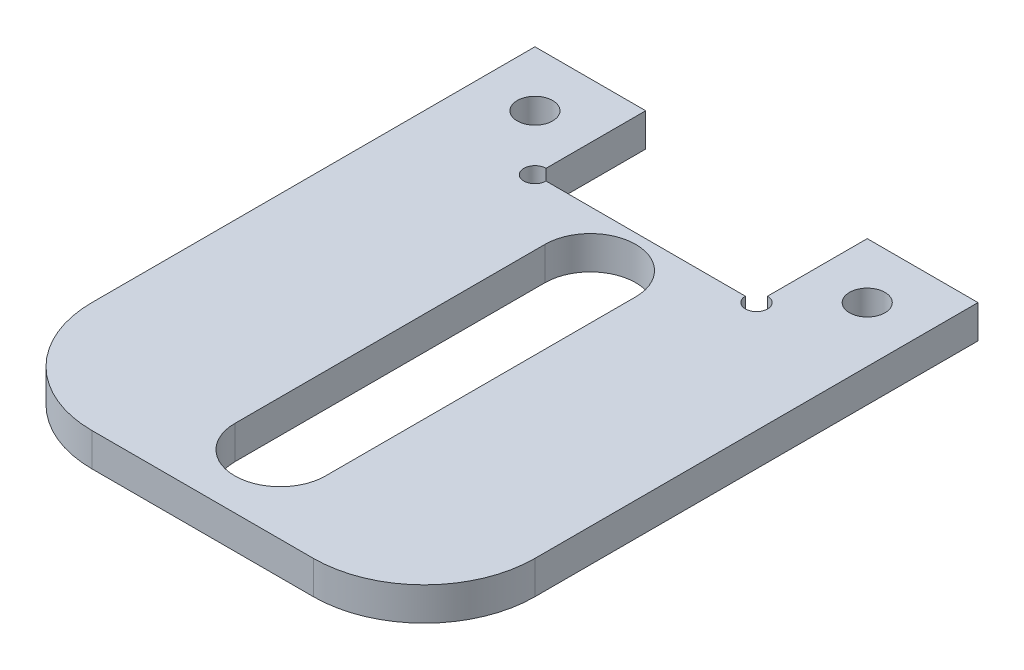
ISO-10303-21;
HEADER;
FILE_DESCRIPTION(('STEP AP214'),'2;1');
FILE_NAME('part.step','',(''),(''),'','','');
FILE_SCHEMA(('AUTOMOTIVE_DESIGN { 1 0 10303 214 1 1 1 1 }'));
ENDSEC;
DATA;
#1=APPLICATION_CONTEXT('core data for automotive mechanical design processes');
#2=APPLICATION_PROTOCOL_DEFINITION('international standard','automotive_design',2000,#1);
#3=PRODUCT_CONTEXT('',#1,'mechanical');
#4=PRODUCT('Part','Part','',(#3));
#5=PRODUCT_RELATED_PRODUCT_CATEGORY('part','',(#4));
#6=PRODUCT_DEFINITION_FORMATION('','',#4);
#7=PRODUCT_DEFINITION_CONTEXT('part definition',#1,'design');
#8=PRODUCT_DEFINITION('design','',#6,#7);
#9=PRODUCT_DEFINITION_SHAPE('','',#8);
#10=(LENGTH_UNIT() NAMED_UNIT(*) SI_UNIT(.MILLI.,.METRE.));
#11=(NAMED_UNIT(*) PLANE_ANGLE_UNIT() SI_UNIT($,.RADIAN.));
#12=(NAMED_UNIT(*) SI_UNIT($,.STERADIAN.) SOLID_ANGLE_UNIT());
#13=UNCERTAINTY_MEASURE_WITH_UNIT(LENGTH_MEASURE(1.E-05),#10,'distance_accuracy_value','');
#14=(GEOMETRIC_REPRESENTATION_CONTEXT(3) GLOBAL_UNCERTAINTY_ASSIGNED_CONTEXT((#13)) GLOBAL_UNIT_ASSIGNED_CONTEXT((#10,
#11,#12)) REPRESENTATION_CONTEXT('',''));
#15=CARTESIAN_POINT('',(0.,0.,0.));
#16=DIRECTION('',(0.,0.,1.));
#17=DIRECTION('',(1.,0.,0.));
#18=AXIS2_PLACEMENT_3D('',#15,#16,#17);
#19=CARTESIAN_POINT('',(0.,3.,0.));
#20=DIRECTION('',(0.,1.,0.));
#21=DIRECTION('',(0.,0.,1.));
#22=AXIS2_PLACEMENT_3D('',#19,#20,#21);
#23=PLANE('',#22);
#24=CARTESIAN_POINT('',(-10.,3.,-15.));
#25=DIRECTION('',(0.,1.,0.));
#26=DIRECTION('',(0.,0.,1.));
#27=AXIS2_PLACEMENT_3D('',#24,#25,#26);
#28=CIRCLE('',#27,0.999999999999999);
#29=CARTESIAN_POINT('',(-10.,3.,-16.));
#30=VERTEX_POINT('',#29);
#31=CARTESIAN_POINT('',(-9.,3.,-15.));
#32=VERTEX_POINT('',#31);
#33=EDGE_CURVE('E157',#30,#32,#28,.T.);
#34=ORIENTED_EDGE('',*,*,#33,.F.);
#35=DIRECTION('',(0.,0.,-1.));
#36=VECTOR('',#35,1.);
#37=CARTESIAN_POINT('',(-10.,3.,-25.));
#38=LINE('',#37,#36);
#39=CARTESIAN_POINT('',(-10.,3.,-25.));
#40=VERTEX_POINT('',#39);
#41=EDGE_CURVE('E181',#30,#40,#38,.T.);
#42=ORIENTED_EDGE('',*,*,#41,.T.);
#43=DIRECTION('',(-1.,0.,0.));
#44=VECTOR('',#43,1.);
#45=CARTESIAN_POINT('',(-20.,3.,-25.));
#46=LINE('',#45,#44);
#47=CARTESIAN_POINT('',(-20.,3.,-25.));
#48=VERTEX_POINT('',#47);
#49=EDGE_CURVE('E186',#40,#48,#46,.T.);
#50=ORIENTED_EDGE('',*,*,#49,.T.);
#51=DIRECTION('',(0.,0.,1.));
#52=VECTOR('',#51,1.);
#53=CARTESIAN_POINT('',(-20.,3.,25.));
#54=LINE('',#53,#52);
#55=CARTESIAN_POINT('',(-20.,3.,15.));
#56=VERTEX_POINT('',#55);
#57=EDGE_CURVE('E194',#48,#56,#54,.T.);
#58=ORIENTED_EDGE('',*,*,#57,.T.);
#59=CARTESIAN_POINT('',(-10.,3.,15.));
#60=DIRECTION('',(0.,1.,0.));
#61=DIRECTION('',(0.,0.,1.));
#62=AXIS2_PLACEMENT_3D('',#59,#60,#61);
#63=CIRCLE('',#62,10.);
#64=CARTESIAN_POINT('',(-10.,3.,25.));
#65=VERTEX_POINT('',#64);
#66=EDGE_CURVE('E266',#56,#65,#63,.T.);
#67=ORIENTED_EDGE('',*,*,#66,.T.);
#68=DIRECTION('',(1.,0.,0.));
#69=VECTOR('',#68,1.);
#70=CARTESIAN_POINT('',(-20.,3.,25.));
#71=LINE('',#70,#69);
#72=CARTESIAN_POINT('',(10.,3.,25.));
#73=VERTEX_POINT('',#72);
#74=EDGE_CURVE('E198',#65,#73,#71,.T.);
#75=ORIENTED_EDGE('',*,*,#74,.T.);
#76=CARTESIAN_POINT('',(10.,3.,15.));
#77=DIRECTION('',(0.,1.,0.));
#78=DIRECTION('',(0.,0.,1.));
#79=AXIS2_PLACEMENT_3D('',#76,#77,#78);
#80=CIRCLE('',#79,10.);
#81=CARTESIAN_POINT('',(20.,3.,15.));
#82=VERTEX_POINT('',#81);
#83=EDGE_CURVE('E269',#73,#82,#80,.T.);
#84=ORIENTED_EDGE('',*,*,#83,.T.);
#85=DIRECTION('',(0.,0.,-1.));
#86=VECTOR('',#85,1.);
#87=CARTESIAN_POINT('',(20.,3.,25.));
#88=LINE('',#87,#86);
#89=CARTESIAN_POINT('',(20.,3.,-25.));
#90=VERTEX_POINT('',#89);
#91=EDGE_CURVE('E202',#82,#90,#88,.T.);
#92=ORIENTED_EDGE('',*,*,#91,.T.);
#93=DIRECTION('',(-1.,0.,0.));
#94=VECTOR('',#93,1.);
#95=CARTESIAN_POINT('',(10.,3.,-25.));
#96=LINE('',#95,#94);
#97=CARTESIAN_POINT('',(10.,3.,-25.));
#98=VERTEX_POINT('',#97);
#99=EDGE_CURVE('E188',#90,#98,#96,.T.);
#100=ORIENTED_EDGE('',*,*,#99,.T.);
#101=DIRECTION('',(0.,0.,1.));
#102=VECTOR('',#101,1.);
#103=CARTESIAN_POINT('',(10.,3.,-15.));
#104=LINE('',#103,#102);
#105=CARTESIAN_POINT('',(10.,3.,-16.));
#106=VERTEX_POINT('',#105);
#107=EDGE_CURVE('E182',#98,#106,#104,.T.);
#108=ORIENTED_EDGE('',*,*,#107,.T.);
#109=CARTESIAN_POINT('',(10.,3.,-15.));
#110=DIRECTION('',(0.,1.,0.));
#111=DIRECTION('',(0.,0.,1.));
#112=AXIS2_PLACEMENT_3D('',#109,#110,#111);
#113=CIRCLE('',#112,1.);
#114=CARTESIAN_POINT('',(9.,3.,-15.));
#115=VERTEX_POINT('',#114);
#116=EDGE_CURVE('E165',#115,#106,#113,.T.);
#117=ORIENTED_EDGE('',*,*,#116,.F.);
#118=DIRECTION('',(-1.,0.,0.));
#119=VECTOR('',#118,1.);
#120=CARTESIAN_POINT('',(-10.,3.,-15.));
#121=LINE('',#120,#119);
#122=EDGE_CURVE('E171',#115,#32,#121,.T.);
#123=ORIENTED_EDGE('',*,*,#122,.T.);
#124=EDGE_LOOP('',(#34,#42,#50,#58,#67,#75,#84,#92,#100,#108,#117,#123));
#125=FACE_BOUND('',#124,.T.);
#126=CARTESIAN_POINT('',(-15.,3.,-20.));
#127=DIRECTION('',(0.,1.,0.));
#128=DIRECTION('',(0.,0.,1.));
#129=AXIS2_PLACEMENT_3D('',#126,#127,#128);
#130=CIRCLE('',#129,1.6);
#131=CARTESIAN_POINT('',(-15.,3.,-18.4));
#132=VERTEX_POINT('',#131);
#133=EDGE_CURVE('E332',#132,#132,#130,.T.);
#134=ORIENTED_EDGE('',*,*,#133,.F.);
#135=EDGE_LOOP('',(#134));
#136=FACE_BOUND('',#135,.T.);
#137=DIRECTION('',(0.,0.,1.));
#138=VECTOR('',#137,1.);
#139=CARTESIAN_POINT('',(-4.1,3.,-9.99999999999999));
#140=LINE('',#139,#138);
#141=CARTESIAN_POINT('',(-4.1,3.,-9.99999999999999));
#142=VERTEX_POINT('',#141);
#143=CARTESIAN_POINT('',(-4.1,3.,18.));
#144=VERTEX_POINT('',#143);
#145=EDGE_CURVE('E343',#142,#144,#140,.T.);
#146=ORIENTED_EDGE('',*,*,#145,.F.);
#147=CARTESIAN_POINT('',(0.,3.,-9.99999999999999));
#148=DIRECTION('',(0.,1.,0.));
#149=DIRECTION('',(0.,0.,1.));
#150=AXIS2_PLACEMENT_3D('',#147,#148,#149);
#151=CIRCLE('',#150,4.1);
#152=CARTESIAN_POINT('',(4.1,3.,-10.));
#153=VERTEX_POINT('',#152);
#154=EDGE_CURVE('E340',#153,#142,#151,.T.);
#155=ORIENTED_EDGE('',*,*,#154,.F.);
#156=DIRECTION('',(0.,0.,-1.));
#157=VECTOR('',#156,1.);
#158=CARTESIAN_POINT('',(4.1,3.,-10.));
#159=LINE('',#158,#157);
#160=CARTESIAN_POINT('',(4.1,3.,18.));
#161=VERTEX_POINT('',#160);
#162=EDGE_CURVE('E351',#161,#153,#159,.T.);
#163=ORIENTED_EDGE('',*,*,#162,.F.);
#164=CARTESIAN_POINT('',(0.,3.,18.));
#165=DIRECTION('',(0.,1.,0.));
#166=DIRECTION('',(0.,0.,1.));
#167=AXIS2_PLACEMENT_3D('',#164,#165,#166);
#168=CIRCLE('',#167,4.1);
#169=EDGE_CURVE('E347',#144,#161,#168,.T.);
#170=ORIENTED_EDGE('',*,*,#169,.F.);
#171=EDGE_LOOP('',(#146,#155,#163,#170));
#172=FACE_BOUND('',#171,.T.);
#173=CARTESIAN_POINT('',(15.,3.,-20.));
#174=DIRECTION('',(0.,1.,0.));
#175=DIRECTION('',(0.,0.,1.));
#176=AXIS2_PLACEMENT_3D('',#173,#174,#175);
#177=CIRCLE('',#176,1.6);
#178=CARTESIAN_POINT('',(15.,3.,-18.4));
#179=VERTEX_POINT('',#178);
#180=EDGE_CURVE('E324',#179,#179,#177,.T.);
#181=ORIENTED_EDGE('',*,*,#180,.F.);
#182=EDGE_LOOP('',(#181));
#183=FACE_BOUND('',#182,.T.);
#184=ADVANCED_FACE('F46',(#125,#136,#172,#183),#23,.T.);
#185=CARTESIAN_POINT('',(0.,0.,0.));
#186=DIRECTION('',(0.,1.,0.));
#187=DIRECTION('',(0.,0.,1.));
#188=AXIS2_PLACEMENT_3D('',#185,#186,#187);
#189=PLANE('',#188);
#190=DIRECTION('',(0.,0.,-1.));
#191=VECTOR('',#190,1.);
#192=CARTESIAN_POINT('',(-10.,0.,-25.));
#193=LINE('',#192,#191);
#194=CARTESIAN_POINT('',(-10.,0.,-16.));
#195=VERTEX_POINT('',#194);
#196=CARTESIAN_POINT('',(-10.,0.,-25.));
#197=VERTEX_POINT('',#196);
#198=EDGE_CURVE('E217',#195,#197,#193,.T.);
#199=ORIENTED_EDGE('',*,*,#198,.F.);
#200=CARTESIAN_POINT('',(-10.,0.,-15.));
#201=DIRECTION('',(0.,1.,0.));
#202=DIRECTION('',(0.,0.,1.));
#203=AXIS2_PLACEMENT_3D('',#200,#201,#202);
#204=CIRCLE('',#203,0.999999999999999);
#205=CARTESIAN_POINT('',(-9.,0.,-15.));
#206=VERTEX_POINT('',#205);
#207=EDGE_CURVE('E69',#195,#206,#204,.T.);
#208=ORIENTED_EDGE('',*,*,#207,.T.);
#209=DIRECTION('',(-1.,0.,0.));
#210=VECTOR('',#209,1.);
#211=CARTESIAN_POINT('',(-10.,0.,-15.));
#212=LINE('',#211,#210);
#213=CARTESIAN_POINT('',(9.,0.,-15.));
#214=VERTEX_POINT('',#213);
#215=EDGE_CURVE('E173',#214,#206,#212,.T.);
#216=ORIENTED_EDGE('',*,*,#215,.F.);
#217=CARTESIAN_POINT('',(10.,0.,-15.));
#218=DIRECTION('',(0.,1.,0.));
#219=DIRECTION('',(0.,0.,1.));
#220=AXIS2_PLACEMENT_3D('',#217,#218,#219);
#221=CIRCLE('',#220,1.);
#222=CARTESIAN_POINT('',(10.,0.,-16.));
#223=VERTEX_POINT('',#222);
#224=EDGE_CURVE('E62',#214,#223,#221,.T.);
#225=ORIENTED_EDGE('',*,*,#224,.T.);
#226=DIRECTION('',(0.,0.,1.));
#227=VECTOR('',#226,1.);
#228=CARTESIAN_POINT('',(10.,0.,-15.));
#229=LINE('',#228,#227);
#230=CARTESIAN_POINT('',(10.,0.,-25.));
#231=VERTEX_POINT('',#230);
#232=EDGE_CURVE('E210',#231,#223,#229,.T.);
#233=ORIENTED_EDGE('',*,*,#232,.F.);
#234=DIRECTION('',(-1.,0.,0.));
#235=VECTOR('',#234,1.);
#236=CARTESIAN_POINT('',(10.,0.,-25.));
#237=LINE('',#236,#235);
#238=CARTESIAN_POINT('',(20.,0.,-25.));
#239=VERTEX_POINT('',#238);
#240=EDGE_CURVE('E206',#239,#231,#237,.T.);
#241=ORIENTED_EDGE('',*,*,#240,.F.);
#242=DIRECTION('',(0.,0.,-1.));
#243=VECTOR('',#242,1.);
#244=CARTESIAN_POINT('',(20.,0.,25.));
#245=LINE('',#244,#243);
#246=CARTESIAN_POINT('',(20.,0.,15.));
#247=VERTEX_POINT('',#246);
#248=EDGE_CURVE('E231',#247,#239,#245,.T.);
#249=ORIENTED_EDGE('',*,*,#248,.F.);
#250=CARTESIAN_POINT('',(10.,0.,15.));
#251=DIRECTION('',(0.,1.,0.));
#252=DIRECTION('',(0.,0.,1.));
#253=AXIS2_PLACEMENT_3D('',#250,#251,#252);
#254=CIRCLE('',#253,10.);
#255=CARTESIAN_POINT('',(10.,0.,25.));
#256=VERTEX_POINT('',#255);
#257=EDGE_CURVE('E256',#247,#256,#254,.F.);
#258=ORIENTED_EDGE('',*,*,#257,.T.);
#259=DIRECTION('',(1.,0.,0.));
#260=VECTOR('',#259,1.);
#261=CARTESIAN_POINT('',(-20.,0.,25.));
#262=LINE('',#261,#260);
#263=CARTESIAN_POINT('',(-10.,0.,25.));
#264=VERTEX_POINT('',#263);
#265=EDGE_CURVE('E227',#264,#256,#262,.T.);
#266=ORIENTED_EDGE('',*,*,#265,.F.);
#267=CARTESIAN_POINT('',(-10.,0.,15.));
#268=DIRECTION('',(0.,1.,0.));
#269=DIRECTION('',(0.,0.,1.));
#270=AXIS2_PLACEMENT_3D('',#267,#268,#269);
#271=CIRCLE('',#270,10.);
#272=CARTESIAN_POINT('',(-20.,0.,15.));
#273=VERTEX_POINT('',#272);
#274=EDGE_CURVE('E253',#264,#273,#271,.F.);
#275=ORIENTED_EDGE('',*,*,#274,.T.);
#276=DIRECTION('',(0.,0.,1.));
#277=VECTOR('',#276,1.);
#278=CARTESIAN_POINT('',(-20.,0.,25.));
#279=LINE('',#278,#277);
#280=CARTESIAN_POINT('',(-20.,0.,-25.));
#281=VERTEX_POINT('',#280);
#282=EDGE_CURVE('E223',#281,#273,#279,.T.);
#283=ORIENTED_EDGE('',*,*,#282,.F.);
#284=DIRECTION('',(-1.,0.,0.));
#285=VECTOR('',#284,1.);
#286=CARTESIAN_POINT('',(-20.,0.,-25.));
#287=LINE('',#286,#285);
#288=EDGE_CURVE('E220',#197,#281,#287,.T.);
#289=ORIENTED_EDGE('',*,*,#288,.F.);
#290=EDGE_LOOP('',(#199,#208,#216,#225,#233,#241,#249,#258,#266,#275,#283,#289));
#291=FACE_BOUND('',#290,.T.);
#292=CARTESIAN_POINT('',(0.,0.,-9.99999999999999));
#293=DIRECTION('',(0.,1.,0.));
#294=DIRECTION('',(0.,0.,1.));
#295=AXIS2_PLACEMENT_3D('',#292,#293,#294);
#296=CIRCLE('',#295,4.1);
#297=CARTESIAN_POINT('',(4.1,0.,-10.));
#298=VERTEX_POINT('',#297);
#299=CARTESIAN_POINT('',(-4.1,0.,-9.99999999999999));
#300=VERTEX_POINT('',#299);
#301=EDGE_CURVE('E336',#298,#300,#296,.T.);
#302=ORIENTED_EDGE('',*,*,#301,.T.);
#303=DIRECTION('',(0.,0.,1.));
#304=VECTOR('',#303,1.);
#305=CARTESIAN_POINT('',(-4.1,0.,-9.99999999999999));
#306=LINE('',#305,#304);
#307=CARTESIAN_POINT('',(-4.1,0.,18.));
#308=VERTEX_POINT('',#307);
#309=EDGE_CURVE('E358',#300,#308,#306,.T.);
#310=ORIENTED_EDGE('',*,*,#309,.T.);
#311=CARTESIAN_POINT('',(0.,0.,18.));
#312=DIRECTION('',(0.,1.,0.));
#313=DIRECTION('',(0.,0.,1.));
#314=AXIS2_PLACEMENT_3D('',#311,#312,#313);
#315=CIRCLE('',#314,4.1);
#316=CARTESIAN_POINT('',(4.1,0.,18.));
#317=VERTEX_POINT('',#316);
#318=EDGE_CURVE('E362',#308,#317,#315,.T.);
#319=ORIENTED_EDGE('',*,*,#318,.T.);
#320=DIRECTION('',(0.,0.,-1.));
#321=VECTOR('',#320,1.);
#322=CARTESIAN_POINT('',(4.1,0.,-10.));
#323=LINE('',#322,#321);
#324=EDGE_CURVE('E344',#317,#298,#323,.T.);
#325=ORIENTED_EDGE('',*,*,#324,.T.);
#326=EDGE_LOOP('',(#302,#310,#319,#325));
#327=FACE_BOUND('',#326,.T.);
#328=CARTESIAN_POINT('',(-15.,0.,-20.));
#329=DIRECTION('',(0.,1.,0.));
#330=DIRECTION('',(0.,0.,1.));
#331=AXIS2_PLACEMENT_3D('',#328,#329,#330);
#332=CIRCLE('',#331,1.6);
#333=CARTESIAN_POINT('',(-15.,0.,-18.4));
#334=VERTEX_POINT('',#333);
#335=EDGE_CURVE('E330',#334,#334,#332,.T.);
#336=ORIENTED_EDGE('',*,*,#335,.T.);
#337=EDGE_LOOP('',(#336));
#338=FACE_BOUND('',#337,.T.);
#339=CARTESIAN_POINT('',(15.,0.,-20.));
#340=DIRECTION('',(0.,1.,0.));
#341=DIRECTION('',(0.,0.,1.));
#342=AXIS2_PLACEMENT_3D('',#339,#340,#341);
#343=CIRCLE('',#342,1.6);
#344=CARTESIAN_POINT('',(15.,0.,-18.4));
#345=VERTEX_POINT('',#344);
#346=EDGE_CURVE('E320',#345,#345,#343,.T.);
#347=ORIENTED_EDGE('',*,*,#346,.T.);
#348=EDGE_LOOP('',(#347));
#349=FACE_BOUND('',#348,.T.);
#350=ADVANCED_FACE('F281',(#291,#327,#338,#349),#189,.F.);
#351=CARTESIAN_POINT('',(10.,3.,-25.));
#352=DIRECTION('',(0.,0.,1.));
#353=DIRECTION('',(1.,0.,0.));
#354=AXIS2_PLACEMENT_3D('',#351,#352,#353);
#355=PLANE('',#354);
#356=ORIENTED_EDGE('',*,*,#240,.T.);
#357=DIRECTION('',(0.,-1.,0.));
#358=VECTOR('',#357,1.);
#359=CARTESIAN_POINT('',(10.,3.,-25.));
#360=LINE('',#359,#358);
#361=EDGE_CURVE('E245',#98,#231,#360,.T.);
#362=ORIENTED_EDGE('',*,*,#361,.F.);
#363=ORIENTED_EDGE('',*,*,#99,.F.);
#364=DIRECTION('',(0.,-1.,0.));
#365=VECTOR('',#364,1.);
#366=CARTESIAN_POINT('',(20.,3.,-25.));
#367=LINE('',#366,#365);
#368=EDGE_CURVE('E205',#90,#239,#367,.T.);
#369=ORIENTED_EDGE('',*,*,#368,.T.);
#370=EDGE_LOOP('',(#356,#362,#363,#369));
#371=FACE_BOUND('',#370,.T.);
#372=ADVANCED_FACE('F315',(#371),#355,.F.);
#373=CARTESIAN_POINT('',(10.,3.,-15.));
#374=DIRECTION('',(1.,0.,0.));
#375=DIRECTION('',(0.,0.,-1.));
#376=AXIS2_PLACEMENT_3D('',#373,#374,#375);
#377=PLANE('',#376);
#378=ORIENTED_EDGE('',*,*,#232,.T.);
#379=DIRECTION('',(0.,1.,0.));
#380=VECTOR('',#379,1.);
#381=CARTESIAN_POINT('',(10.,0.,-16.));
#382=LINE('',#381,#380);
#383=EDGE_CURVE('E175',#223,#106,#382,.T.);
#384=ORIENTED_EDGE('',*,*,#383,.T.);
#385=ORIENTED_EDGE('',*,*,#107,.F.);
#386=ORIENTED_EDGE('',*,*,#361,.T.);
#387=EDGE_LOOP('',(#378,#384,#385,#386));
#388=FACE_BOUND('',#387,.T.);
#389=ADVANCED_FACE('F317',(#388),#377,.F.);
#390=CARTESIAN_POINT('',(-10.,3.,-15.));
#391=DIRECTION('',(0.,0.,1.));
#392=DIRECTION('',(1.,0.,0.));
#393=AXIS2_PLACEMENT_3D('',#390,#391,#392);
#394=PLANE('',#393);
#395=ORIENTED_EDGE('',*,*,#215,.T.);
#396=DIRECTION('',(0.,1.,0.));
#397=VECTOR('',#396,1.);
#398=CARTESIAN_POINT('',(-9.,0.,-15.));
#399=LINE('',#398,#397);
#400=EDGE_CURVE('E160',#206,#32,#399,.T.);
#401=ORIENTED_EDGE('',*,*,#400,.T.);
#402=ORIENTED_EDGE('',*,*,#122,.F.);
#403=DIRECTION('',(0.,1.,0.));
#404=VECTOR('',#403,1.);
#405=CARTESIAN_POINT('',(9.,0.,-15.));
#406=LINE('',#405,#404);
#407=EDGE_CURVE('E11',#115,#214,#406,.F.);
#408=ORIENTED_EDGE('',*,*,#407,.T.);
#409=EDGE_LOOP('',(#395,#401,#402,#408));
#410=FACE_BOUND('',#409,.T.);
#411=ADVANCED_FACE('F170',(#410),#394,.F.);
#412=CARTESIAN_POINT('',(-10.,3.,-25.));
#413=DIRECTION('',(-1.,0.,0.));
#414=DIRECTION('',(0.,0.,1.));
#415=AXIS2_PLACEMENT_3D('',#412,#413,#414);
#416=PLANE('',#415);
#417=ORIENTED_EDGE('',*,*,#41,.F.);
#418=DIRECTION('',(0.,1.,0.));
#419=VECTOR('',#418,1.);
#420=CARTESIAN_POINT('',(-10.,0.,-16.));
#421=LINE('',#420,#419);
#422=EDGE_CURVE('E55',#30,#195,#421,.F.);
#423=ORIENTED_EDGE('',*,*,#422,.T.);
#424=ORIENTED_EDGE('',*,*,#198,.T.);
#425=DIRECTION('',(0.,-1.,0.));
#426=VECTOR('',#425,1.);
#427=CARTESIAN_POINT('',(-10.,3.,-25.));
#428=LINE('',#427,#426);
#429=EDGE_CURVE('E241',#40,#197,#428,.T.);
#430=ORIENTED_EDGE('',*,*,#429,.F.);
#431=EDGE_LOOP('',(#417,#423,#424,#430));
#432=FACE_BOUND('',#431,.T.);
#433=ADVANCED_FACE('F277',(#432),#416,.F.);
#434=CARTESIAN_POINT('',(-20.,3.,-25.));
#435=DIRECTION('',(0.,0.,1.));
#436=DIRECTION('',(1.,0.,0.));
#437=AXIS2_PLACEMENT_3D('',#434,#435,#436);
#438=PLANE('',#437);
#439=ORIENTED_EDGE('',*,*,#288,.T.);
#440=DIRECTION('',(0.,-1.,0.));
#441=VECTOR('',#440,1.);
#442=CARTESIAN_POINT('',(-20.,3.,-25.));
#443=LINE('',#442,#441);
#444=EDGE_CURVE('E237',#48,#281,#443,.T.);
#445=ORIENTED_EDGE('',*,*,#444,.F.);
#446=ORIENTED_EDGE('',*,*,#49,.F.);
#447=ORIENTED_EDGE('',*,*,#429,.T.);
#448=EDGE_LOOP('',(#439,#445,#446,#447));
#449=FACE_BOUND('',#448,.T.);
#450=ADVANCED_FACE('F286',(#449),#438,.F.);
#451=CARTESIAN_POINT('',(-20.,3.,25.));
#452=DIRECTION('',(1.,0.,0.));
#453=DIRECTION('',(0.,0.,-1.));
#454=AXIS2_PLACEMENT_3D('',#451,#452,#453);
#455=PLANE('',#454);
#456=ORIENTED_EDGE('',*,*,#282,.T.);
#457=DIRECTION('',(0.,-1.,0.));
#458=VECTOR('',#457,1.);
#459=CARTESIAN_POINT('',(-20.,3.,15.));
#460=LINE('',#459,#458);
#461=EDGE_CURVE('E272',#273,#56,#460,.F.);
#462=ORIENTED_EDGE('',*,*,#461,.T.);
#463=ORIENTED_EDGE('',*,*,#57,.F.);
#464=ORIENTED_EDGE('',*,*,#444,.T.);
#465=EDGE_LOOP('',(#456,#462,#463,#464));
#466=FACE_BOUND('',#465,.T.);
#467=ADVANCED_FACE('F290',(#466),#455,.F.);
#468=CARTESIAN_POINT('',(-20.,3.,25.));
#469=DIRECTION('',(0.,0.,-1.));
#470=DIRECTION('',(-1.,0.,0.));
#471=AXIS2_PLACEMENT_3D('',#468,#469,#470);
#472=PLANE('',#471);
#473=ORIENTED_EDGE('',*,*,#265,.T.);
#474=DIRECTION('',(0.,-1.,0.));
#475=VECTOR('',#474,1.);
#476=CARTESIAN_POINT('',(10.,3.,25.));
#477=LINE('',#476,#475);
#478=EDGE_CURVE('E263',#256,#73,#477,.F.);
#479=ORIENTED_EDGE('',*,*,#478,.T.);
#480=ORIENTED_EDGE('',*,*,#74,.F.);
#481=DIRECTION('',(0.,-1.,0.));
#482=VECTOR('',#481,1.);
#483=CARTESIAN_POINT('',(-10.,3.,25.));
#484=LINE('',#483,#482);
#485=EDGE_CURVE('E259',#65,#264,#484,.T.);
#486=ORIENTED_EDGE('',*,*,#485,.T.);
#487=EDGE_LOOP('',(#473,#479,#480,#486));
#488=FACE_BOUND('',#487,.T.);
#489=ADVANCED_FACE('F298',(#488),#472,.F.);
#490=CARTESIAN_POINT('',(20.,3.,25.));
#491=DIRECTION('',(-1.,0.,0.));
#492=DIRECTION('',(0.,0.,1.));
#493=AXIS2_PLACEMENT_3D('',#490,#491,#492);
#494=PLANE('',#493);
#495=ORIENTED_EDGE('',*,*,#91,.F.);
#496=DIRECTION('',(0.,-1.,0.));
#497=VECTOR('',#496,1.);
#498=CARTESIAN_POINT('',(20.,3.,15.));
#499=LINE('',#498,#497);
#500=EDGE_CURVE('E249',#82,#247,#499,.T.);
#501=ORIENTED_EDGE('',*,*,#500,.T.);
#502=ORIENTED_EDGE('',*,*,#248,.T.);
#503=ORIENTED_EDGE('',*,*,#368,.F.);
#504=EDGE_LOOP('',(#495,#501,#502,#503));
#505=FACE_BOUND('',#504,.T.);
#506=ADVANCED_FACE('F308',(#505),#494,.F.);
#507=CARTESIAN_POINT('',(0.,3.,-9.99999999999999));
#508=DIRECTION('',(0.,-1.,0.));
#509=DIRECTION('',(0.,0.,-1.));
#510=AXIS2_PLACEMENT_3D('',#507,#508,#509);
#511=CYLINDRICAL_SURFACE('',#510,4.1);
#512=ORIENTED_EDGE('',*,*,#301,.F.);
#513=DIRECTION('',(0.,-1.,0.));
#514=VECTOR('',#513,1.);
#515=CARTESIAN_POINT('',(4.1,3.,-10.));
#516=LINE('',#515,#514);
#517=EDGE_CURVE('E354',#153,#298,#516,.T.);
#518=ORIENTED_EDGE('',*,*,#517,.F.);
#519=ORIENTED_EDGE('',*,*,#154,.T.);
#520=DIRECTION('',(0.,-1.,0.));
#521=VECTOR('',#520,1.);
#522=CARTESIAN_POINT('',(-4.1,3.,-9.99999999999999));
#523=LINE('',#522,#521);
#524=EDGE_CURVE('E211',#142,#300,#523,.T.);
#525=ORIENTED_EDGE('',*,*,#524,.T.);
#526=EDGE_LOOP('',(#512,#518,#519,#525));
#527=FACE_BOUND('',#526,.T.);
#528=ADVANCED_FACE('F382',(#527),#511,.F.);
#529=CARTESIAN_POINT('',(-4.1,3.,-9.99999999999999));
#530=DIRECTION('',(1.,0.,0.));
#531=DIRECTION('',(0.,0.,-1.));
#532=AXIS2_PLACEMENT_3D('',#529,#530,#531);
#533=PLANE('',#532);
#534=ORIENTED_EDGE('',*,*,#309,.F.);
#535=ORIENTED_EDGE('',*,*,#524,.F.);
#536=ORIENTED_EDGE('',*,*,#145,.T.);
#537=DIRECTION('',(0.,-1.,0.));
#538=VECTOR('',#537,1.);
#539=CARTESIAN_POINT('',(-4.1,3.,18.));
#540=LINE('',#539,#538);
#541=EDGE_CURVE('E375',#144,#308,#540,.T.);
#542=ORIENTED_EDGE('',*,*,#541,.T.);
#543=EDGE_LOOP('',(#534,#535,#536,#542));
#544=FACE_BOUND('',#543,.T.);
#545=ADVANCED_FACE('F397',(#544),#533,.T.);
#546=CARTESIAN_POINT('',(0.,3.,18.));
#547=DIRECTION('',(0.,-1.,0.));
#548=DIRECTION('',(0.,0.,-1.));
#549=AXIS2_PLACEMENT_3D('',#546,#547,#548);
#550=CYLINDRICAL_SURFACE('',#549,4.1);
#551=ORIENTED_EDGE('',*,*,#318,.F.);
#552=ORIENTED_EDGE('',*,*,#541,.F.);
#553=ORIENTED_EDGE('',*,*,#169,.T.);
#554=DIRECTION('',(0.,-1.,0.));
#555=VECTOR('',#554,1.);
#556=CARTESIAN_POINT('',(4.1,3.,18.));
#557=LINE('',#556,#555);
#558=EDGE_CURVE('E372',#161,#317,#557,.T.);
#559=ORIENTED_EDGE('',*,*,#558,.T.);
#560=EDGE_LOOP('',(#551,#552,#553,#559));
#561=FACE_BOUND('',#560,.T.);
#562=ADVANCED_FACE('F399',(#561),#550,.F.);
#563=CARTESIAN_POINT('',(4.1,3.,-10.));
#564=DIRECTION('',(-1.,0.,0.));
#565=DIRECTION('',(0.,0.,1.));
#566=AXIS2_PLACEMENT_3D('',#563,#564,#565);
#567=PLANE('',#566);
#568=ORIENTED_EDGE('',*,*,#324,.F.);
#569=ORIENTED_EDGE('',*,*,#558,.F.);
#570=ORIENTED_EDGE('',*,*,#162,.T.);
#571=ORIENTED_EDGE('',*,*,#517,.T.);
#572=EDGE_LOOP('',(#568,#569,#570,#571));
#573=FACE_BOUND('',#572,.T.);
#574=ADVANCED_FACE('F391',(#573),#567,.T.);
#575=CARTESIAN_POINT('',(-15.,3.,-20.));
#576=DIRECTION('',(0.,-1.,0.));
#577=DIRECTION('',(0.,0.,-1.));
#578=AXIS2_PLACEMENT_3D('',#575,#576,#577);
#579=CYLINDRICAL_SURFACE('',#578,1.6);
#580=ORIENTED_EDGE('',*,*,#133,.T.);
#581=EDGE_LOOP('',(#580));
#582=FACE_BOUND('',#581,.T.);
#583=ORIENTED_EDGE('',*,*,#335,.F.);
#584=EDGE_LOOP('',(#583));
#585=FACE_BOUND('',#584,.T.);
#586=ADVANCED_FACE('F406',(#582,#585),#579,.F.);
#587=CARTESIAN_POINT('',(15.,3.,-20.));
#588=DIRECTION('',(0.,-1.,0.));
#589=DIRECTION('',(0.,0.,-1.));
#590=AXIS2_PLACEMENT_3D('',#587,#588,#589);
#591=CYLINDRICAL_SURFACE('',#590,1.6);
#592=ORIENTED_EDGE('',*,*,#180,.T.);
#593=EDGE_LOOP('',(#592));
#594=FACE_BOUND('',#593,.T.);
#595=ORIENTED_EDGE('',*,*,#346,.F.);
#596=EDGE_LOOP('',(#595));
#597=FACE_BOUND('',#596,.T.);
#598=ADVANCED_FACE('F433',(#594,#597),#591,.F.);
#599=CARTESIAN_POINT('',(10.,3.,15.));
#600=DIRECTION('',(0.,-1.,0.));
#601=DIRECTION('',(0.,0.,-1.));
#602=AXIS2_PLACEMENT_3D('',#599,#600,#601);
#603=CYLINDRICAL_SURFACE('',#602,10.);
#604=ORIENTED_EDGE('',*,*,#83,.F.);
#605=ORIENTED_EDGE('',*,*,#478,.F.);
#606=ORIENTED_EDGE('',*,*,#257,.F.);
#607=ORIENTED_EDGE('',*,*,#500,.F.);
#608=EDGE_LOOP('',(#604,#605,#606,#607));
#609=FACE_BOUND('',#608,.T.);
#610=ADVANCED_FACE('F305',(#609),#603,.T.);
#611=CARTESIAN_POINT('',(-10.,3.,15.));
#612=DIRECTION('',(0.,-1.,0.));
#613=DIRECTION('',(0.,0.,-1.));
#614=AXIS2_PLACEMENT_3D('',#611,#612,#613);
#615=CYLINDRICAL_SURFACE('',#614,10.);
#616=ORIENTED_EDGE('',*,*,#66,.F.);
#617=ORIENTED_EDGE('',*,*,#461,.F.);
#618=ORIENTED_EDGE('',*,*,#274,.F.);
#619=ORIENTED_EDGE('',*,*,#485,.F.);
#620=EDGE_LOOP('',(#616,#617,#618,#619));
#621=FACE_BOUND('',#620,.T.);
#622=ADVANCED_FACE('F48',(#621),#615,.T.);
#623=CARTESIAN_POINT('',(-10.,0.,-15.));
#624=DIRECTION('',(0.,1.,0.));
#625=DIRECTION('',(0.,0.,1.));
#626=AXIS2_PLACEMENT_3D('',#623,#624,#625);
#627=CYLINDRICAL_SURFACE('',#626,0.999999999999999);
#628=ORIENTED_EDGE('',*,*,#207,.F.);
#629=ORIENTED_EDGE('',*,*,#422,.F.);
#630=ORIENTED_EDGE('',*,*,#33,.T.);
#631=ORIENTED_EDGE('',*,*,#400,.F.);
#632=EDGE_LOOP('',(#628,#629,#630,#631));
#633=FACE_BOUND('',#632,.T.);
#634=ADVANCED_FACE('F159',(#633),#627,.F.);
#635=CARTESIAN_POINT('',(10.,0.,-15.));
#636=DIRECTION('',(0.,1.,0.));
#637=DIRECTION('',(0.,0.,1.));
#638=AXIS2_PLACEMENT_3D('',#635,#636,#637);
#639=CYLINDRICAL_SURFACE('',#638,1.);
#640=ORIENTED_EDGE('',*,*,#224,.F.);
#641=ORIENTED_EDGE('',*,*,#407,.F.);
#642=ORIENTED_EDGE('',*,*,#116,.T.);
#643=ORIENTED_EDGE('',*,*,#383,.F.);
#644=EDGE_LOOP('',(#640,#641,#642,#643));
#645=FACE_BOUND('',#644,.T.);
#646=ADVANCED_FACE('F447',(#645),#639,.F.);
#647=CLOSED_SHELL('',(#184,#350,#372,#389,#411,#433,#450,#467,#489,#506,#528,#545,#562,#574,
#586,#598,#610,#622,#634,#646));
#648=MANIFOLD_SOLID_BREP('B2',#647);
#649=ADVANCED_BREP_SHAPE_REPRESENTATION('',(#18,#648),#14);
#650=SHAPE_DEFINITION_REPRESENTATION(#9,#649);
ENDSEC;
END-ISO-10303-21;
